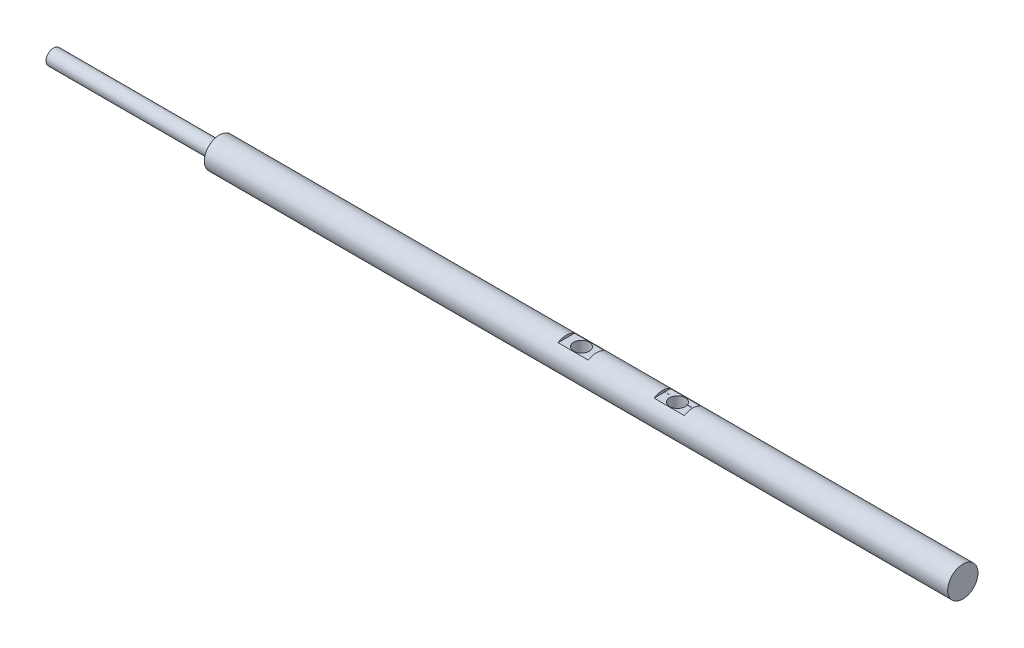
ISO-10303-21;
HEADER;
FILE_DESCRIPTION(('STEP AP214'),'2;1');
FILE_NAME('part.step','',(''),(''),'','','');
FILE_SCHEMA(('AUTOMOTIVE_DESIGN { 1 0 10303 214 1 1 1 1 }'));
ENDSEC;
DATA;
#1=APPLICATION_CONTEXT('core data for automotive mechanical design processes');
#2=APPLICATION_PROTOCOL_DEFINITION('international standard','automotive_design',2000,#1);
#3=PRODUCT_CONTEXT('',#1,'mechanical');
#4=PRODUCT('Part','Part','',(#3));
#5=PRODUCT_RELATED_PRODUCT_CATEGORY('part','',(#4));
#6=PRODUCT_DEFINITION_FORMATION('','',#4);
#7=PRODUCT_DEFINITION_CONTEXT('part definition',#1,'design');
#8=PRODUCT_DEFINITION('design','',#6,#7);
#9=PRODUCT_DEFINITION_SHAPE('','',#8);
#10=(LENGTH_UNIT() NAMED_UNIT(*) SI_UNIT(.MILLI.,.METRE.));
#11=(NAMED_UNIT(*) PLANE_ANGLE_UNIT() SI_UNIT($,.RADIAN.));
#12=(NAMED_UNIT(*) SI_UNIT($,.STERADIAN.) SOLID_ANGLE_UNIT());
#13=UNCERTAINTY_MEASURE_WITH_UNIT(LENGTH_MEASURE(1.E-05),#10,'distance_accuracy_value','');
#14=(GEOMETRIC_REPRESENTATION_CONTEXT(3) GLOBAL_UNCERTAINTY_ASSIGNED_CONTEXT((#13)) GLOBAL_UNIT_ASSIGNED_CONTEXT((#10,
#11,#12)) REPRESENTATION_CONTEXT('',''));
#15=CARTESIAN_POINT('',(0.,0.,0.));
#16=DIRECTION('',(0.,0.,1.));
#17=DIRECTION('',(1.,0.,0.));
#18=AXIS2_PLACEMENT_3D('',#15,#16,#17);
#19=CARTESIAN_POINT('',(95.25,0.,0.));
#20=DIRECTION('',(-1.,0.,0.));
#21=DIRECTION('',(0.,0.,1.));
#22=AXIS2_PLACEMENT_3D('',#19,#20,#21);
#23=CYLINDRICAL_SURFACE('',#22,3.175);
#24=CARTESIAN_POINT('',(95.25,0.,0.));
#25=DIRECTION('',(1.,0.,0.));
#26=DIRECTION('',(0.,0.,-1.));
#27=AXIS2_PLACEMENT_3D('',#24,#25,#26);
#28=CIRCLE('',#27,3.175);
#29=CARTESIAN_POINT('',(95.25,0.,-3.175));
#30=VERTEX_POINT('',#29);
#31=EDGE_CURVE('E203',#30,#30,#28,.T.);
#32=ORIENTED_EDGE('',*,*,#31,.F.);
#33=EDGE_LOOP('',(#32));
#34=FACE_BOUND('',#33,.T.);
#35=CARTESIAN_POINT('',(38.633343193379,0.,0.));
#36=DIRECTION('',(-0.999999999985996,5.29223403398786E-06,0.));
#37=DIRECTION('',(-5.29223403398786E-06,-0.999999999985996,0.));
#38=AXIS2_PLACEMENT_3D('',#35,#36,#37);
#39=ELLIPSE('',#38,3.17500000004446,3.175);
#40=CARTESIAN_POINT('',(38.6333599958514,3.17492996585615,-0.0210881935847739));
#41=VERTEX_POINT('',#40);
#42=CARTESIAN_POINT('',(38.6333573073966,2.66692996586326,-1.72282023356489));
#43=VERTEX_POINT('',#42);
#44=EDGE_CURVE('E248',#41,#43,#39,.T.);
#45=ORIENTED_EDGE('',*,*,#44,.F.);
#46=CARTESIAN_POINT('',(38.665309995851,3.17492979676927,-0.0211136350879527));
#47=CARTESIAN_POINT('',(37.5963265134474,3.17493545408003,-0.0202846489398166));
#48=CARTESIAN_POINT('',(36.5273431055831,3.17494111139039,-0.019375173684114));
#49=CARTESIAN_POINT('',(34.3893764389464,3.17495242601032,-0.0173952449575876));
#50=CARTESIAN_POINT('',(33.320393180174,3.17495808331989,-0.0163247914867658));
#51=CARTESIAN_POINT('',(32.2514099959409,3.17496374062907,-0.0151738489083794));
#52=B_SPLINE_CURVE_WITH_KNOTS('',3,(#46,#47,#48,#49,#50,#51),.UNSPECIFIED.,.F.,.F.,(4,2,4),(0.,
3.20695138428964,6.41390276853995),.UNSPECIFIED.);
#53=CARTESIAN_POINT('',(37.0902296318532,3.17493813246316,-0.0198205709133526));
#54=VERTEX_POINT('',#53);
#55=EDGE_CURVE('E196',#41,#54,#52,.T.);
#56=ORIENTED_EDGE('',*,*,#55,.T.);
#57=CARTESIAN_POINT('',(37.090229631876,3.17493813246316,-0.0198205709136295));
#58=CARTESIAN_POINT('',(37.0902496934034,3.17494844352971,-0.01816890604515));
#59=CARTESIAN_POINT('',(37.0902672475911,3.17495746590815,-0.0165172026754431));
#60=CARTESIAN_POINT('',(37.0902973403694,3.17497293280011,-0.0132137838652389));
#61=CARTESIAN_POINT('',(37.0903098790988,3.17497937738492,-0.0115620684263389));
#62=CARTESIAN_POINT('',(37.0903299409676,3.17498968867624,-0.00825862950065401));
#63=CARTESIAN_POINT('',(37.0903374641996,3.17499355543029,-0.00660690601457919));
#64=CARTESIAN_POINT('',(37.0903474951304,3.17499871108029,-0.00330345501888027));
#65=CARTESIAN_POINT('',(37.0903500028756,3.175,-0.00165172750943369));
#66=CARTESIAN_POINT('',(37.0903500028756,3.175,0.00165172750945899));
#67=CARTESIAN_POINT('',(37.0903474951304,3.17499871108029,0.0033034550189051));
#68=CARTESIAN_POINT('',(37.0903374641996,3.17499355543029,0.00660690601460308));
#69=CARTESIAN_POINT('',(37.0903299409676,3.17498968867624,0.00825862950067743));
#70=CARTESIAN_POINT('',(37.0903098790988,3.17497937738492,0.0115620684263614));
#71=CARTESIAN_POINT('',(37.0902973403694,3.17497293280011,0.0132137838652609));
#72=CARTESIAN_POINT('',(37.0902672475911,3.17495746590815,0.0165172026754633));
#73=CARTESIAN_POINT('',(37.0902496934034,3.17494844352971,0.0181689060451687));
#74=CARTESIAN_POINT('',(37.090229631876,3.17493813246316,0.0198205709136468));
#75=B_SPLINE_CURVE_WITH_KNOTS('',3,(#57,#58,#59,#60,#61,#62,#63,#64,#65,#66,#67,#68,#69,#70,#71,
#72,#73,#74),.UNSPECIFIED.,.F.,.F.,(4,2,2,2,2,2,2,2,4),(0.,0.00495545424362061,
0.00991077142824259,0.0148659972380935,0.0198211773599271,0.0247763574817593,0.0297315832916088,
0.0346869004762294,0.0396423547198458),.UNSPECIFIED.);
#76=CARTESIAN_POINT('',(37.0902296318532,3.17493813246316,0.0198205709133696));
#77=VERTEX_POINT('',#76);
#78=EDGE_CURVE('E258',#54,#77,#75,.T.);
#79=ORIENTED_EDGE('',*,*,#78,.T.);
#80=CARTESIAN_POINT('',(32.251409995941,3.17496374062907,0.0151738489083089));
#81=CARTESIAN_POINT('',(33.3203931801741,3.17495808331989,0.0163247914867198));
#82=CARTESIAN_POINT('',(34.3893764389465,3.17495242601032,0.0173952449575659));
#83=CARTESIAN_POINT('',(36.5273431055831,3.17494111139039,0.019375173684141));
#84=CARTESIAN_POINT('',(37.5963265134474,3.17493545408003,0.0202846489398679));
#85=CARTESIAN_POINT('',(38.665309995851,3.17492979676927,0.0211136350880282));
#86=B_SPLINE_CURVE_WITH_KNOTS('',3,(#80,#81,#82,#83,#84,#85),.UNSPECIFIED.,.F.,.F.,(4,2,4),(0.,
3.20695138425026,6.41390276853985),.UNSPECIFIED.);
#87=CARTESIAN_POINT('',(38.6333599958514,3.17492996585615,0.0210881935848646));
#88=VERTEX_POINT('',#87);
#89=EDGE_CURVE('E192',#77,#88,#86,.T.);
#90=ORIENTED_EDGE('',*,*,#89,.T.);
#91=CARTESIAN_POINT('',(38.6333573073966,2.66692996586326,1.72282023356489));
#92=VERTEX_POINT('',#91);
#93=EDGE_CURVE('E255',#92,#88,#39,.T.);
#94=ORIENTED_EDGE('',*,*,#93,.F.);
#95=CARTESIAN_POINT('',(32.2514073074859,2.66696374063618,1.72276794900877));
#96=CARTESIAN_POINT('',(33.3203906408043,2.66695808332621,1.72277670672593));
#97=CARTESIAN_POINT('',(34.3893739741227,2.66695242601625,1.7227854644431));
#98=CARTESIAN_POINT('',(36.5273406407594,2.66694111139632,1.72280297987743));
#99=CARTESIAN_POINT('',(37.5963239740777,2.66693545408635,1.7228117375946));
#100=CARTESIAN_POINT('',(38.6653073073961,2.66692979677639,1.72282049531176));
#101=B_SPLINE_CURVE_WITH_KNOTS('',3,(#95,#96,#97,#98,#99,#100),.UNSPECIFIED.,.F.,.F.,(4,2,4),
(0.,3.20695000010762,6.41390000021524),.UNSPECIFIED.);
#102=CARTESIAN_POINT('',(32.2833573074855,2.6669635715493,1.7227682107669));
#103=VERTEX_POINT('',#102);
#104=EDGE_CURVE('E130',#103,#92,#101,.T.);
#105=ORIENTED_EDGE('',*,*,#104,.F.);
#106=CARTESIAN_POINT('',(32.2833431932901,0.,0.));
#107=DIRECTION('',(-0.999999999985996,5.29223402032862E-06,0.));
#108=DIRECTION('',(-5.29223402032862E-06,-0.999999999985996,0.));
#109=AXIS2_PLACEMENT_3D('',#106,#107,#108);
#110=ELLIPSE('',#109,3.17500000004446,3.175);
#111=CARTESIAN_POINT('',(32.2833599959404,3.17496357154219,0.0152091873574511));
#112=VERTEX_POINT('',#111);
#113=EDGE_CURVE('E257',#103,#112,#110,.T.);
#114=ORIENTED_EDGE('',*,*,#113,.T.);
#115=CARTESIAN_POINT('',(33.8265367630242,3.1749554046896,0.0168279004127774));
#116=VERTEX_POINT('',#115);
#117=EDGE_CURVE('E122',#112,#116,#86,.T.);
#118=ORIENTED_EDGE('',*,*,#117,.T.);
#119=CARTESIAN_POINT('',(33.8265367630014,3.1749554046896,0.016827900412959));
#120=CARTESIAN_POINT('',(33.8265223024111,3.17496283714282,0.0154256055961563));
#121=CARTESIAN_POINT('',(33.8265096492121,3.17496934064082,0.0140232872170993));
#122=CARTESIAN_POINT('',(33.8264879580734,3.17498048947243,0.0112186430720871));
#123=CARTESIAN_POINT('',(33.8264789200617,3.1749851348431,0.00981631730683655));
#124=CARTESIAN_POINT('',(33.826464459294,3.17499256741311,0.0070116608514302));
#125=CARTESIAN_POINT('',(33.82645903649,3.17499535463716,0.00560933016158764));
#126=CARTESIAN_POINT('',(33.8264518061079,3.17499907092443,0.00280466631962063));
#127=CARTESIAN_POINT('',(33.826449998506,3.17499999999999,0.0014023331675745));
#128=CARTESIAN_POINT('',(33.8264499985059,3.17500000000001,-0.00140233313652295));
#129=CARTESIAN_POINT('',(33.8264518061079,3.17499907092445,-0.00280466628857427));
#130=CARTESIAN_POINT('',(33.8264590364899,3.17499535463722,-0.00560933013056246));
#131=CARTESIAN_POINT('',(33.8264644592939,3.17499256741318,-0.00701166082042103));
#132=CARTESIAN_POINT('',(33.8264789200616,3.17498513484319,-0.00981631727587045));
#133=CARTESIAN_POINT('',(33.8264879580732,3.17498048947254,-0.0112186430411481));
#134=CARTESIAN_POINT('',(33.8265096492118,3.17496934064095,-0.0140232871862255));
#135=CARTESIAN_POINT('',(33.8265223024108,3.17496283714297,-0.0154256055653207));
#136=CARTESIAN_POINT('',(33.826536763001,3.17495540468976,-0.0168279003821615));
#137=B_SPLINE_CURVE_WITH_KNOTS('',3,(#119,#120,#121,#122,#123,#124,#125,#126,#127,#128,#129,
#130,#131,#132,#133,#134,#135,#136),.UNSPECIFIED.,.F.,.F.,(4,2,2,2,2,2,2,2,4),(0.,
0.00420716573795598,0.00841424759947161,0.0126212735424362,0.0168282715258546,
0.0210352695092885,0.0252422954523007,0.0294493773138969,0.0336565430519664),.UNSPECIFIED.);
#138=CARTESIAN_POINT('',(33.826536763001,3.17495540468976,-0.01682790038216));
#139=VERTEX_POINT('',#138);
#140=EDGE_CURVE('E264',#116,#139,#137,.T.);
#141=ORIENTED_EDGE('',*,*,#140,.T.);
#142=CARTESIAN_POINT('',(32.2833599959404,3.17496357154219,-0.0152091873573705));
#143=VERTEX_POINT('',#142);
#144=EDGE_CURVE('E64',#139,#143,#52,.T.);
#145=ORIENTED_EDGE('',*,*,#144,.T.);
#146=CARTESIAN_POINT('',(32.2833573074855,2.6669635715493,-1.7227682107669));
#147=VERTEX_POINT('',#146);
#148=EDGE_CURVE('E261',#143,#147,#110,.T.);
#149=ORIENTED_EDGE('',*,*,#148,.T.);
#150=CARTESIAN_POINT('',(38.6653073073961,2.66692979677639,-1.72282049531176));
#151=CARTESIAN_POINT('',(37.5963239740778,2.66693545408635,-1.7228117375946));
#152=CARTESIAN_POINT('',(36.5273406407594,2.66694111139632,-1.72280297987743));
#153=CARTESIAN_POINT('',(34.3893739741227,2.66695242601625,-1.7227854644431));
#154=CARTESIAN_POINT('',(33.3203906408043,2.66695808332621,-1.72277670672593));
#155=CARTESIAN_POINT('',(32.2514073074859,2.66696374063618,-1.72276794900877));
#156=B_SPLINE_CURVE_WITH_KNOTS('',3,(#150,#151,#152,#153,#154,#155),.UNSPECIFIED.,.F.,.F.,(4,2,
4),(0.,3.20695000010762,6.41390000021525),.UNSPECIFIED.);
#157=EDGE_CURVE('E137',#43,#147,#156,.T.);
#158=ORIENTED_EDGE('',*,*,#157,.F.);
#159=EDGE_LOOP('',(#45,#56,#79,#90,#94,#105,#114,#118,#141,#145,#149,#158));
#160=FACE_BOUND('',#159,.T.);
#161=CARTESIAN_POINT('',(33.82645,-3.175,0.));
#162=CARTESIAN_POINT('',(33.8264555225033,-3.1749951488375,0.0855040308867798));
#163=CARTESIAN_POINT('',(33.833209178857,-3.17150945034314,0.171101240980394));
#164=CARTESIAN_POINT('',(33.8599163776356,-3.15790866903868,0.339747436628674));
#165=CARTESIAN_POINT('',(33.8798930920065,-3.14778194886196,0.422791680581357));
#166=CARTESIAN_POINT('',(33.9320492367121,-3.12195472243027,0.583638724841476));
#167=CARTESIAN_POINT('',(33.964180383854,-3.10627628578511,0.661460848087696));
#168=CARTESIAN_POINT('',(34.0394733428141,-3.07076815311594,0.810484123550455));
#169=CARTESIAN_POINT('',(34.0826346813397,-3.05093863521649,0.881685559674045));
#170=CARTESIAN_POINT('',(34.1818395604511,-3.00746719747756,1.02048121130391));
#171=CARTESIAN_POINT('',(34.2385224488686,-2.98366396287073,1.08756713179621));
#172=CARTESIAN_POINT('',(34.3617778321314,-2.93542614793103,1.2117528273621));
#173=CARTESIAN_POINT('',(34.428358245603,-2.91099107513947,1.2688445260646));
#174=CARTESIAN_POINT('',(34.5761429961395,-2.86190360269902,1.37619030697555));
#175=CARTESIAN_POINT('',(34.6581028961507,-2.83740198308611,1.42548150207459));
#176=CARTESIAN_POINT('',(34.8305279187006,-2.79368352283181,1.50937386299453));
#177=CARTESIAN_POINT('',(34.920986670407,-2.77446276535017,1.5439859268111));
#178=CARTESIAN_POINT('',(35.1022318810971,-2.74531170361422,1.59521646703193));
#179=CARTESIAN_POINT('',(35.1926597461213,-2.73488497790481,1.6128061882074));
#180=CARTESIAN_POINT('',(35.3757330951833,-2.72321398214475,1.63244506669711));
#181=CARTESIAN_POINT('',(35.4683760410271,-2.72195966421048,1.63451122931009));
#182=CARTESIAN_POINT('',(35.6404642889754,-2.72838052371714,1.62375488998901));
#183=CARTESIAN_POINT('',(35.7200793205153,-2.73493188161208,1.61280661192532));
#184=CARTESIAN_POINT('',(35.8761289781891,-2.754244052702,1.57959805780023));
#185=CARTESIAN_POINT('',(35.9525624793788,-2.76700704233323,1.55733381672187));
#186=CARTESIAN_POINT('',(36.1022619863812,-2.79757317703649,1.50174237151051));
#187=CARTESIAN_POINT('',(36.1754140956642,-2.81548590050608,1.46817158068447));
#188=CARTESIAN_POINT('',(36.3154068420419,-2.85434643346265,1.3911117741889));
#189=CARTESIAN_POINT('',(36.3822446252442,-2.87529560459822,1.34761830379583));
#190=CARTESIAN_POINT('',(36.5172112960908,-2.9212823355769,1.24510866496992));
#191=CARTESIAN_POINT('',(36.5842961673622,-2.94649001082675,1.18478955639875));
#192=CARTESIAN_POINT('',(36.7078475723355,-2.99587607308416,1.05368879547657));
#193=CARTESIAN_POINT('',(36.7643084679871,-3.02005390832908,0.98290162320231));
#194=CARTESIAN_POINT('',(36.8677700161712,-3.06617549731913,0.828265705690738));
#195=CARTESIAN_POINT('',(36.9141314172438,-3.08793935855511,0.743931167771745));
#196=CARTESIAN_POINT('',(36.9916180876571,-3.12521410360782,0.567260694455102));
#197=CARTESIAN_POINT('',(37.0227560898711,-3.14073021113217,0.474931522136976));
#198=CARTESIAN_POINT('',(37.0662353646927,-3.16262223827194,0.293387639639186));
#199=CARTESIAN_POINT('',(37.0799610922109,-3.16966860606962,0.204586275933954));
#200=CARTESIAN_POINT('',(37.0926065067292,-3.17615517440242,0.0256756682936774));
#201=CARTESIAN_POINT('',(37.0915338203541,-3.1755992928927,-0.0644328780430845));
#202=CARTESIAN_POINT('',(37.0753694600984,-3.16732011452037,-0.23544240019834));
#203=CARTESIAN_POINT('',(37.0614474939361,-3.16019489932875,-0.316487355429185));
#204=CARTESIAN_POINT('',(37.0218532383627,-3.14029584966157,-0.474914137414346));
#205=CARTESIAN_POINT('',(36.9961796852722,-3.12752140771467,-0.552295569232576));
#206=CARTESIAN_POINT('',(36.9331979936897,-3.0970332421052,-0.7036598506893));
#207=CARTESIAN_POINT('',(36.8955917765208,-3.07919436719925,-0.777492553668178));
#208=CARTESIAN_POINT('',(36.8101576756426,-3.04025788262466,-0.918032193793199));
#209=CARTESIAN_POINT('',(36.7623255652911,-3.01915892647785,-0.984736167288267));
#210=CARTESIAN_POINT('',(36.6521647755565,-2.97316030571577,-1.11637209875045));
#211=CARTESIAN_POINT('',(36.5888535975356,-2.94809264371233,-1.18042445249867));
#212=CARTESIAN_POINT('',(36.4524099268942,-2.89851338679948,-1.29741693757462));
#213=CARTESIAN_POINT('',(36.3792697567467,-2.87400224426709,-1.35034829848397));
#214=CARTESIAN_POINT('',(36.2201223874983,-2.82692373103994,-1.44642697458146));
#215=CARTESIAN_POINT('',(36.1336238429623,-2.80454223847877,-1.4888598544623));
#216=CARTESIAN_POINT('',(35.9532087006801,-2.76667242464635,-1.55811686536916));
#217=CARTESIAN_POINT('',(35.8593023439866,-2.75117477674318,-1.58496213065223));
#218=CARTESIAN_POINT('',(35.6764853526163,-2.73084264145901,-1.61972010578002));
#219=CARTESIAN_POINT('',(35.5879787017558,-2.72511675716505,-1.62922186279037));
#220=CARTESIAN_POINT('',(35.410487714574,-2.72246308853736,-1.63365628662516));
#221=CARTESIAN_POINT('',(35.3215036525793,-2.72553069992366,-1.62859657783691));
#222=CARTESIAN_POINT('',(35.1555499074751,-2.73915192416445,-1.60555713446221));
#223=CARTESIAN_POINT('',(35.0783054098004,-2.74887888063314,-1.5890014905719));
#224=CARTESIAN_POINT('',(34.9277982454205,-2.77369521283357,-1.54527280818542));
#225=CARTESIAN_POINT('',(34.8545369351526,-2.78878640228,-1.51809617829068));
#226=CARTESIAN_POINT('',(34.7086581146745,-2.82384943425746,-1.4518910164788));
#227=CARTESIAN_POINT('',(34.6364078760544,-2.84407923565314,-1.41219413521422));
#228=CARTESIAN_POINT('',(34.4991147021694,-2.88675020129082,-1.32278190926592));
#229=CARTESIAN_POINT('',(34.4340756362287,-2.9091925406384,-1.27306122601301));
#230=CARTESIAN_POINT('',(34.3041779098411,-2.95727706115646,-1.15738981002724));
#231=CARTESIAN_POINT('',(34.2404590585516,-2.98295328229731,-1.09016618990103));
#232=CARTESIAN_POINT('',(34.1249126673504,-3.03196509152523,-0.945333004302651));
#233=CARTESIAN_POINT('',(34.0730920125456,-3.05529932000234,-0.867717466275219));
#234=CARTESIAN_POINT('',(33.9824042427265,-3.09746555259877,-0.702628256295633));
#235=CARTESIAN_POINT('',(33.9437237810696,-3.11623168849883,-0.615034384222225));
#236=CARTESIAN_POINT('',(33.8821591182301,-3.14661314164253,-0.433428747203517));
#237=CARTESIAN_POINT('',(33.8592310751803,-3.15824829587962,-0.33943560166896));
#238=CARTESIAN_POINT('',(33.8386932306584,-3.16872129723131,-0.203672524735642));
#239=CARTESIAN_POINT('',(33.8341093436488,-3.17106888783632,-0.163117552345112));
#240=CARTESIAN_POINT('',(33.8279863698368,-3.17420941832953,-0.0817154873383494));
#241=CARTESIAN_POINT('',(33.8264473604074,-3.1750023187116,-0.0408683873253513));
#242=CARTESIAN_POINT('',(33.82645,-3.175,0.));
#243=B_SPLINE_CURVE_WITH_KNOTS('',3,(#161,#162,#163,#164,#165,#166,#167,#168,#169,#170,#171,
#172,#173,#174,#175,#176,#177,#178,#179,#180,#181,#182,#183,#184,#185,#186,#187,#188,#189,#190,
#191,#192,#193,#194,#195,#196,#197,#198,#199,#200,#201,#202,#203,#204,#205,#206,#207,#208,#209,
#210,#211,#212,#213,#214,#215,#216,#217,#218,#219,#220,#221,#222,#223,#224,#225,#226,#227,#228,
#229,#230,#231,#232,#233,#234,#235,#236,#237,#238,#239,#240,#241,#242),.UNSPECIFIED.,.T.,.F.,(4,
2,2,2,2,2,2,2,2,2,2,2,2,2,2,2,2,2,2,2,2,2,2,2,2,2,2,2,2,2,2,2,2,2,2,2,2,2,2,2,4),(0.,
0.256346681545549,0.513143775789515,0.768931283875209,1.02470781826618,1.29656656346873,
1.56864399473168,1.86333819539519,2.15781322626888,2.43427334950282,2.7104305799831,
2.95119493604626,3.19204371210589,3.43845399875805,3.68497512818485,3.96477950659083,
4.24473195848559,4.53914409915751,4.83330957000078,5.10221547434752,5.37098279845146,
5.61746624990917,5.86397621261563,6.11720599093002,6.37054063911958,6.64979553878125,
6.92926984912037,7.22440425351108,7.51913756384894,7.78517049872054,8.05106416402478,
8.28881648429829,8.5266492682086,8.78030889713808,9.03410398105976,9.32114681972758,
9.60835534464034,9.89948790747401,10.1898068764044,10.3123298633967,10.4348559637725),.UNSPECIFIED.);
#244=CARTESIAN_POINT('',(33.82645,-3.175,0.));
#245=VERTEX_POINT('',#244);
#246=EDGE_CURVE('E206',#245,#245,#243,.T.);
#247=ORIENTED_EDGE('',*,*,#246,.T.);
#248=EDGE_LOOP('',(#247));
#249=FACE_BOUND('',#248,.T.);
#250=DIRECTION('',(-1.,0.,0.));
#251=VECTOR('',#250,1.);
#252=CARTESIAN_POINT('',(95.25,2.667,1.72271181571382));
#253=LINE('',#252,#251);
#254=CARTESIAN_POINT('',(18.5166,2.667,1.72271181571382));
#255=VERTEX_POINT('',#254);
#256=CARTESIAN_POINT('',(12.1666,2.667,1.72271181571382));
#257=VERTEX_POINT('',#256);
#258=EDGE_CURVE('E117',#255,#257,#253,.T.);
#259=ORIENTED_EDGE('',*,*,#258,.T.);
#260=CARTESIAN_POINT('',(12.1666,0.,0.));
#261=DIRECTION('',(-1.,0.,0.));
#262=DIRECTION('',(0.,0.,1.));
#263=AXIS2_PLACEMENT_3D('',#260,#261,#262);
#264=CIRCLE('',#263,3.175);
#265=CARTESIAN_POINT('',(12.1666,2.667,-1.72271181571382));
#266=VERTEX_POINT('',#265);
#267=EDGE_CURVE('E49',#257,#266,#264,.T.);
#268=ORIENTED_EDGE('',*,*,#267,.T.);
#269=DIRECTION('',(-1.,0.,0.));
#270=VECTOR('',#269,1.);
#271=CARTESIAN_POINT('',(95.25,2.667,-1.72271181571382));
#272=LINE('',#271,#270);
#273=CARTESIAN_POINT('',(18.5166,2.667,-1.72271181571382));
#274=VERTEX_POINT('',#273);
#275=EDGE_CURVE('E115',#266,#274,#272,.F.);
#276=ORIENTED_EDGE('',*,*,#275,.T.);
#277=CARTESIAN_POINT('',(18.5166,0.,0.));
#278=DIRECTION('',(-1.,0.,0.));
#279=DIRECTION('',(0.,0.,1.));
#280=AXIS2_PLACEMENT_3D('',#277,#278,#279);
#281=CIRCLE('',#280,3.175);
#282=EDGE_CURVE('E12',#255,#274,#281,.T.);
#283=ORIENTED_EDGE('',*,*,#282,.F.);
#284=EDGE_LOOP('',(#259,#268,#276,#283));
#285=FACE_BOUND('',#284,.T.);
#286=CARTESIAN_POINT('',(13.70965,-3.175,0.));
#287=CARTESIAN_POINT('',(13.7096555225033,-3.1749951488375,0.0855040308867805));
#288=CARTESIAN_POINT('',(13.716409178857,-3.17150945034315,0.171101240980395));
#289=CARTESIAN_POINT('',(13.7431163776356,-3.15790866903868,0.339747436628676));
#290=CARTESIAN_POINT('',(13.7630930920065,-3.14778194886196,0.422791680581358));
#291=CARTESIAN_POINT('',(13.8152492367121,-3.12195472243027,0.583638724841478));
#292=CARTESIAN_POINT('',(13.847380383854,-3.10627628578511,0.661460848087699));
#293=CARTESIAN_POINT('',(13.922673342814,-3.07076815311594,0.810484123550459));
#294=CARTESIAN_POINT('',(13.9658346813397,-3.05093863521649,0.881685559674048));
#295=CARTESIAN_POINT('',(14.0650395604511,-3.00746719747756,1.02048121130391));
#296=CARTESIAN_POINT('',(14.1217224488686,-2.98366396287073,1.08756713179621));
#297=CARTESIAN_POINT('',(14.2449778321314,-2.93542614793103,1.2117528273621));
#298=CARTESIAN_POINT('',(14.311558245603,-2.91099107513947,1.2688445260646));
#299=CARTESIAN_POINT('',(14.4593429961395,-2.86190360269902,1.37619030697555));
#300=CARTESIAN_POINT('',(14.5413028961507,-2.8374019830861,1.4254815020746));
#301=CARTESIAN_POINT('',(14.7137279187006,-2.79368352283181,1.50937386299454));
#302=CARTESIAN_POINT('',(14.804186670407,-2.77446276535016,1.54398592681111));
#303=CARTESIAN_POINT('',(14.9854318810971,-2.74531170361422,1.59521646703194));
#304=CARTESIAN_POINT('',(15.0758597461213,-2.7348849779048,1.61280618820741));
#305=CARTESIAN_POINT('',(15.2589330951833,-2.72321398214474,1.63244506669712));
#306=CARTESIAN_POINT('',(15.3515760410271,-2.72195966421048,1.63451122931009));
#307=CARTESIAN_POINT('',(15.5236642889754,-2.72838052371713,1.62375488998901));
#308=CARTESIAN_POINT('',(15.6032793205153,-2.73493188161207,1.61280661192532));
#309=CARTESIAN_POINT('',(15.7593289781891,-2.754244052702,1.57959805780023));
#310=CARTESIAN_POINT('',(15.8357624793788,-2.76700704233323,1.55733381672187));
#311=CARTESIAN_POINT('',(15.9854619863812,-2.79757317703649,1.50174237151051));
#312=CARTESIAN_POINT('',(16.0586140956642,-2.81548590050608,1.46817158068447));
#313=CARTESIAN_POINT('',(16.1986068420419,-2.85434643346265,1.3911117741889));
#314=CARTESIAN_POINT('',(16.2654446252442,-2.87529560459822,1.34761830379583));
#315=CARTESIAN_POINT('',(16.4004112960908,-2.9212823355769,1.24510866496992));
#316=CARTESIAN_POINT('',(16.4674961673622,-2.94649001082675,1.18478955639875));
#317=CARTESIAN_POINT('',(16.5910475723355,-2.99587607308416,1.05368879547657));
#318=CARTESIAN_POINT('',(16.6475084679871,-3.02005390832908,0.982901623202313));
#319=CARTESIAN_POINT('',(16.7509700161712,-3.06617549731913,0.828265705690739));
#320=CARTESIAN_POINT('',(16.7973314172438,-3.08793935855511,0.743931167771745));
#321=CARTESIAN_POINT('',(16.8748180876571,-3.12521410360782,0.567260694455102));
#322=CARTESIAN_POINT('',(16.9059560898711,-3.14073021113217,0.474931522136976));
#323=CARTESIAN_POINT('',(16.9494353646927,-3.16262223827194,0.293387639639186));
#324=CARTESIAN_POINT('',(16.9631610922109,-3.16966860606962,0.204586275933954));
#325=CARTESIAN_POINT('',(16.9758065067292,-3.17615517440242,0.0256756682936787));
#326=CARTESIAN_POINT('',(16.9747338203541,-3.1755992928927,-0.0644328780430827));
#327=CARTESIAN_POINT('',(16.9585694600984,-3.16732011452037,-0.23544240019834));
#328=CARTESIAN_POINT('',(16.9446474939361,-3.16019489932875,-0.316487355429186));
#329=CARTESIAN_POINT('',(16.9050532383627,-3.14029584966157,-0.474914137414348));
#330=CARTESIAN_POINT('',(16.8793796852722,-3.12752140771467,-0.552295569232577));
#331=CARTESIAN_POINT('',(16.8163979936897,-3.0970332421052,-0.703659850689299));
#332=CARTESIAN_POINT('',(16.7787917765208,-3.07919436719925,-0.777492553668176));
#333=CARTESIAN_POINT('',(16.6933576756426,-3.04025788262466,-0.918032193793198));
#334=CARTESIAN_POINT('',(16.6455255652911,-3.01915892647785,-0.984736167288267));
#335=CARTESIAN_POINT('',(16.5353647755565,-2.97316030571577,-1.11637209875045));
#336=CARTESIAN_POINT('',(16.4720535975356,-2.94809264371233,-1.18042445249867));
#337=CARTESIAN_POINT('',(16.3356099268942,-2.89851338679948,-1.29741693757462));
#338=CARTESIAN_POINT('',(16.2624697567467,-2.87400224426708,-1.35034829848397));
#339=CARTESIAN_POINT('',(16.1033223874983,-2.82692373103994,-1.44642697458146));
#340=CARTESIAN_POINT('',(16.0168238429623,-2.80454223847877,-1.4888598544623));
#341=CARTESIAN_POINT('',(15.8364087006801,-2.76667242464635,-1.55811686536916));
#342=CARTESIAN_POINT('',(15.7425023439866,-2.75117477674318,-1.58496213065223));
#343=CARTESIAN_POINT('',(15.5596853526163,-2.73084264145901,-1.61972010578002));
#344=CARTESIAN_POINT('',(15.4711787017558,-2.72511675716505,-1.62922186279037));
#345=CARTESIAN_POINT('',(15.293687714574,-2.72246308853735,-1.63365628662517));
#346=CARTESIAN_POINT('',(15.2047036525793,-2.72553069992366,-1.62859657783691));
#347=CARTESIAN_POINT('',(15.0387499074751,-2.73915192416444,-1.60555713446222));
#348=CARTESIAN_POINT('',(14.9615054098004,-2.74887888063314,-1.5890014905719));
#349=CARTESIAN_POINT('',(14.8109982454205,-2.77369521283357,-1.54527280818543));
#350=CARTESIAN_POINT('',(14.7377369351526,-2.78878640228,-1.51809617829069));
#351=CARTESIAN_POINT('',(14.5918581146745,-2.82384943425745,-1.4518910164788));
#352=CARTESIAN_POINT('',(14.5196078760544,-2.84407923565314,-1.41219413521423));
#353=CARTESIAN_POINT('',(14.3823147021694,-2.88675020129082,-1.32278190926592));
#354=CARTESIAN_POINT('',(14.3172756362287,-2.9091925406384,-1.27306122601301));
#355=CARTESIAN_POINT('',(14.1873779098411,-2.95727706115646,-1.15738981002724));
#356=CARTESIAN_POINT('',(14.1236590585516,-2.98295328229731,-1.09016618990104));
#357=CARTESIAN_POINT('',(14.0081126673504,-3.03196509152523,-0.945333004302657));
#358=CARTESIAN_POINT('',(13.9562920125456,-3.05529932000234,-0.867717466275226));
#359=CARTESIAN_POINT('',(13.8656042427264,-3.09746555259877,-0.70262825629564));
#360=CARTESIAN_POINT('',(13.8269237810695,-3.11623168849883,-0.615034384222231));
#361=CARTESIAN_POINT('',(13.7653591182301,-3.14661314164253,-0.433428747203523));
#362=CARTESIAN_POINT('',(13.7424310751803,-3.15824829587962,-0.339435601668967));
#363=CARTESIAN_POINT('',(13.7218932306584,-3.16872129723131,-0.203672524735649));
#364=CARTESIAN_POINT('',(13.7173093436488,-3.17106888783632,-0.163117552345117));
#365=CARTESIAN_POINT('',(13.7111863698368,-3.17420941832953,-0.0817154873383522));
#366=CARTESIAN_POINT('',(13.7096473604074,-3.1750023187116,-0.0408683873253526));
#367=CARTESIAN_POINT('',(13.70965,-3.175,0.));
#368=B_SPLINE_CURVE_WITH_KNOTS('',3,(#286,#287,#288,#289,#290,#291,#292,#293,#294,#295,#296,
#297,#298,#299,#300,#301,#302,#303,#304,#305,#306,#307,#308,#309,#310,#311,#312,#313,#314,#315,
#316,#317,#318,#319,#320,#321,#322,#323,#324,#325,#326,#327,#328,#329,#330,#331,#332,#333,#334,
#335,#336,#337,#338,#339,#340,#341,#342,#343,#344,#345,#346,#347,#348,#349,#350,#351,#352,#353,
#354,#355,#356,#357,#358,#359,#360,#361,#362,#363,#364,#365,#366,#367),.UNSPECIFIED.,.T.,.F.,(4,
2,2,2,2,2,2,2,2,2,2,2,2,2,2,2,2,2,2,2,2,2,2,2,2,2,2,2,2,2,2,2,2,2,2,2,2,2,2,2,4),(0.,
0.256346681545551,0.513143775789516,0.768931283875213,1.02470781826619,1.29656656346874,
1.56864399473168,1.86333819539519,2.15781322626888,2.43427334950283,2.71043057998311,
2.95119493604628,3.19204371210591,3.43845399875807,3.68497512818486,3.96477950659084,
4.2447319584856,4.53914409915753,4.8333095700008,5.10221547434754,5.37098279845148,
5.61746624990919,5.86397621261565,6.11720599093004,6.37054063911959,6.64979553878126,
6.92926984912039,7.22440425351111,7.51913756384896,7.78517049872057,8.0510641640248,
8.28881648429831,8.52664926820862,8.7803088971381,9.03410398105978,9.3211468197276,
9.60835534464037,9.89948790747403,10.1898068764044,10.3123298633967,10.4348559637725),.UNSPECIFIED.);
#369=CARTESIAN_POINT('',(13.70965,-3.175,0.));
#370=VERTEX_POINT('',#369);
#371=EDGE_CURVE('E213',#370,#370,#368,.T.);
#372=ORIENTED_EDGE('',*,*,#371,.T.);
#373=EDGE_LOOP('',(#372));
#374=FACE_BOUND('',#373,.T.);
#375=CARTESIAN_POINT('',(-60.49518,0.,0.));
#376=DIRECTION('',(-1.,0.,0.));
#377=DIRECTION('',(0.,0.,1.));
#378=AXIS2_PLACEMENT_3D('',#375,#376,#377);
#379=CIRCLE('',#378,3.175);
#380=CARTESIAN_POINT('',(-60.49518,0.,3.175));
#381=VERTEX_POINT('',#380);
#382=EDGE_CURVE('E308',#381,#381,#379,.T.);
#383=ORIENTED_EDGE('',*,*,#382,.F.);
#384=EDGE_LOOP('',(#383));
#385=FACE_BOUND('',#384,.T.);
#386=ADVANCED_FACE('F40',(#34,#160,#249,#285,#374,#385),#23,.T.);
#387=CARTESIAN_POINT('',(35.4584,-3.175,0.));
#388=DIRECTION('',(0.,1.,0.));
#389=DIRECTION('',(0.,0.,1.));
#390=AXIS2_PLACEMENT_3D('',#387,#388,#389);
#391=CYLINDRICAL_SURFACE('',#390,1.63195);
#392=ORIENTED_EDGE('',*,*,#246,.F.);
#393=EDGE_LOOP('',(#392));
#394=FACE_BOUND('',#393,.T.);
#395=CARTESIAN_POINT('',(35.4584,2.66694676848034,0.));
#396=DIRECTION('',(5.29223402196773E-06,0.999999999985996,0.));
#397=DIRECTION('',(-0.999999999985996,5.29223402196773E-06,0.));
#398=AXIS2_PLACEMENT_3D('',#395,#396,#397);
#399=CIRCLE('',#398,1.63195);
#400=CARTESIAN_POINT('',(33.8264500000229,2.66695540514166,0.));
#401=VERTEX_POINT('',#400);
#402=EDGE_CURVE('E138',#401,#401,#399,.F.);
#403=ORIENTED_EDGE('',*,*,#402,.F.);
#404=EDGE_LOOP('',(#403));
#405=FACE_BOUND('',#404,.T.);
#406=ADVANCED_FACE('F217',(#394,#405),#391,.F.);
#407=CARTESIAN_POINT('',(95.25,0.,0.));
#408=DIRECTION('',(1.,0.,0.));
#409=DIRECTION('',(0.,0.,-1.));
#410=AXIS2_PLACEMENT_3D('',#407,#408,#409);
#411=PLANE('',#410);
#412=ORIENTED_EDGE('',*,*,#31,.T.);
#413=EDGE_LOOP('',(#412));
#414=FACE_BOUND('',#413,.T.);
#415=ADVANCED_FACE('F221',(#414),#411,.T.);
#416=CARTESIAN_POINT('',(15.3416,-3.175,0.));
#417=DIRECTION('',(0.,1.,0.));
#418=DIRECTION('',(0.,0.,1.));
#419=AXIS2_PLACEMENT_3D('',#416,#417,#418);
#420=CYLINDRICAL_SURFACE('',#419,1.63195);
#421=CARTESIAN_POINT('',(15.3416,2.667,0.));
#422=DIRECTION('',(0.,-1.,0.));
#423=DIRECTION('',(0.,0.,-1.));
#424=AXIS2_PLACEMENT_3D('',#421,#422,#423);
#425=CIRCLE('',#424,1.63195);
#426=CARTESIAN_POINT('',(15.3416,2.667,-1.63195));
#427=VERTEX_POINT('',#426);
#428=EDGE_CURVE('E118',#427,#427,#425,.F.);
#429=ORIENTED_EDGE('',*,*,#428,.T.);
#430=EDGE_LOOP('',(#429));
#431=FACE_BOUND('',#430,.T.);
#432=ORIENTED_EDGE('',*,*,#371,.F.);
#433=EDGE_LOOP('',(#432));
#434=FACE_BOUND('',#433,.T.);
#435=ADVANCED_FACE('F223',(#431,#434),#420,.F.);
#436=CARTESIAN_POINT('',(18.5166,0.,-3.175));
#437=DIRECTION('',(-1.,0.,0.));
#438=DIRECTION('',(0.,0.,1.));
#439=AXIS2_PLACEMENT_3D('',#436,#437,#438);
#440=PLANE('',#439);
#441=DIRECTION('',(0.,0.,1.));
#442=VECTOR('',#441,1.);
#443=CARTESIAN_POINT('',(18.5166,2.667,-3.175));
#444=LINE('',#443,#442);
#445=EDGE_CURVE('E108',#274,#255,#444,.T.);
#446=ORIENTED_EDGE('',*,*,#445,.T.);
#447=ORIENTED_EDGE('',*,*,#282,.T.);
#448=EDGE_LOOP('',(#446,#447));
#449=FACE_BOUND('',#448,.T.);
#450=ADVANCED_FACE('F107',(#449),#440,.T.);
#451=CARTESIAN_POINT('',(12.1666,0.,-3.175));
#452=DIRECTION('',(-1.,0.,0.));
#453=DIRECTION('',(0.,0.,1.));
#454=AXIS2_PLACEMENT_3D('',#451,#452,#453);
#455=PLANE('',#454);
#456=DIRECTION('',(0.,0.,1.));
#457=VECTOR('',#456,1.);
#458=CARTESIAN_POINT('',(12.1666,2.667,-3.175));
#459=LINE('',#458,#457);
#460=EDGE_CURVE('E56',#266,#257,#459,.T.);
#461=ORIENTED_EDGE('',*,*,#460,.F.);
#462=ORIENTED_EDGE('',*,*,#267,.F.);
#463=EDGE_LOOP('',(#461,#462));
#464=FACE_BOUND('',#463,.T.);
#465=ADVANCED_FACE('F289',(#464),#455,.F.);
#466=CARTESIAN_POINT('',(0.,2.667,-3.175));
#467=DIRECTION('',(0.,-1.,0.));
#468=DIRECTION('',(0.,0.,-1.));
#469=AXIS2_PLACEMENT_3D('',#466,#467,#468);
#470=PLANE('',#469);
#471=ORIENTED_EDGE('',*,*,#428,.F.);
#472=EDGE_LOOP('',(#471));
#473=FACE_BOUND('',#472,.T.);
#474=ORIENTED_EDGE('',*,*,#445,.F.);
#475=ORIENTED_EDGE('',*,*,#275,.F.);
#476=ORIENTED_EDGE('',*,*,#460,.T.);
#477=ORIENTED_EDGE('',*,*,#258,.F.);
#478=EDGE_LOOP('',(#474,#475,#476,#477));
#479=FACE_BOUND('',#478,.T.);
#480=ADVANCED_FACE('F114',(#473,#479),#470,.F.);
#481=CARTESIAN_POINT('',(38.633343192297,-0.00020445669369187,-3.175));
#482=DIRECTION('',(-0.999999999985996,5.29223403398786E-06,0.));
#483=DIRECTION('',(-5.29223403398786E-06,-0.999999999985996,0.));
#484=AXIS2_PLACEMENT_3D('',#481,#482,#483);
#485=PLANE('',#484);
#486=ORIENTED_EDGE('',*,*,#93,.T.);
#487=DIRECTION('',(0.,0.,1.));
#488=VECTOR('',#487,1.);
#489=CARTESIAN_POINT('',(38.6333599958514,3.17492996585615,-3.175));
#490=LINE('',#489,#488);
#491=EDGE_CURVE('E127',#41,#88,#490,.T.);
#492=ORIENTED_EDGE('',*,*,#491,.F.);
#493=ORIENTED_EDGE('',*,*,#44,.T.);
#494=DIRECTION('',(0.,0.,1.));
#495=VECTOR('',#494,1.);
#496=CARTESIAN_POINT('',(38.6333573073966,2.66692996586326,-3.175));
#497=LINE('',#496,#495);
#498=EDGE_CURVE('E318',#43,#92,#497,.T.);
#499=ORIENTED_EDGE('',*,*,#498,.T.);
#500=EDGE_LOOP('',(#486,#492,#493,#499));
#501=FACE_BOUND('',#500,.T.);
#502=ADVANCED_FACE('F156',(#501),#485,.T.);
#503=CARTESIAN_POINT('',(32.283343192386,-0.000170851007135082,-3.175));
#504=DIRECTION('',(-0.999999999985996,5.29223402032862E-06,0.));
#505=DIRECTION('',(-5.29223402032862E-06,-0.999999999985996,0.));
#506=AXIS2_PLACEMENT_3D('',#503,#504,#505);
#507=PLANE('',#506);
#508=DIRECTION('',(0.,0.,1.));
#509=VECTOR('',#508,1.);
#510=CARTESIAN_POINT('',(32.2833573074855,2.6669635715493,-3.175));
#511=LINE('',#510,#509);
#512=EDGE_CURVE('E321',#147,#103,#511,.T.);
#513=ORIENTED_EDGE('',*,*,#512,.F.);
#514=ORIENTED_EDGE('',*,*,#148,.F.);
#515=DIRECTION('',(0.,0.,1.));
#516=VECTOR('',#515,1.);
#517=CARTESIAN_POINT('',(32.2833599959404,3.17496357154219,-3.175));
#518=LINE('',#517,#516);
#519=EDGE_CURVE('E310',#143,#112,#518,.T.);
#520=ORIENTED_EDGE('',*,*,#519,.T.);
#521=ORIENTED_EDGE('',*,*,#113,.F.);
#522=EDGE_LOOP('',(#513,#514,#520,#521));
#523=FACE_BOUND('',#522,.T.);
#524=ADVANCED_FACE('F150',(#523),#507,.F.);
#525=CARTESIAN_POINT('',(1.41150995324124E-05,2.66713442255649,-3.175));
#526=DIRECTION('',(5.29223402196773E-06,0.999999999985996,0.));
#527=DIRECTION('',(-0.999999999985996,5.29223402196773E-06,0.));
#528=AXIS2_PLACEMENT_3D('',#525,#526,#527);
#529=PLANE('',#528);
#530=ORIENTED_EDGE('',*,*,#402,.T.);
#531=EDGE_LOOP('',(#530));
#532=FACE_BOUND('',#531,.T.);
#533=ORIENTED_EDGE('',*,*,#157,.T.);
#534=ORIENTED_EDGE('',*,*,#512,.T.);
#535=ORIENTED_EDGE('',*,*,#104,.T.);
#536=ORIENTED_EDGE('',*,*,#498,.F.);
#537=EDGE_LOOP('',(#533,#534,#535,#536));
#538=FACE_BOUND('',#537,.T.);
#539=ADVANCED_FACE('F144',(#532,#538),#529,.T.);
#540=CARTESIAN_POINT('',(1.68035544153551E-05,3.17513442254937,-3.175));
#541=DIRECTION('',(5.29223402189943E-06,0.999999999985996,0.));
#542=DIRECTION('',(-0.999999999985996,5.29223402189943E-06,0.));
#543=AXIS2_PLACEMENT_3D('',#540,#541,#542);
#544=PLANE('',#543);
#545=ORIENTED_EDGE('',*,*,#491,.T.);
#546=ORIENTED_EDGE('',*,*,#89,.F.);
#547=ORIENTED_EDGE('',*,*,#78,.F.);
#548=ORIENTED_EDGE('',*,*,#55,.F.);
#549=EDGE_LOOP('',(#545,#546,#547,#548));
#550=FACE_BOUND('',#549,.T.);
#551=ADVANCED_FACE('F149',(#550),#544,.F.);
#552=ORIENTED_EDGE('',*,*,#140,.F.);
#553=ORIENTED_EDGE('',*,*,#117,.F.);
#554=ORIENTED_EDGE('',*,*,#519,.F.);
#555=ORIENTED_EDGE('',*,*,#144,.F.);
#556=EDGE_LOOP('',(#552,#553,#554,#555));
#557=FACE_BOUND('',#556,.T.);
#558=ADVANCED_FACE('F161',(#557),#544,.F.);
#559=CARTESIAN_POINT('',(-95.250012,0.,0.));
#560=DIRECTION('',(1.,0.,0.));
#561=DIRECTION('',(0.,0.,-1.));
#562=AXIS2_PLACEMENT_3D('',#559,#560,#561);
#563=CYLINDRICAL_SURFACE('',#562,1.5875);
#564=CARTESIAN_POINT('',(-60.49518,0.,0.));
#565=DIRECTION('',(-1.,0.,0.));
#566=DIRECTION('',(0.,0.,1.));
#567=AXIS2_PLACEMENT_3D('',#564,#565,#566);
#568=CIRCLE('',#567,1.5875);
#569=CARTESIAN_POINT('',(-60.49518,0.,-1.5875));
#570=VERTEX_POINT('',#569);
#571=EDGE_CURVE('E306',#570,#570,#568,.T.);
#572=CARTESIAN_POINT('',(-95.25,0.,0.));
#573=DIRECTION('',(1.,0.,0.));
#574=DIRECTION('',(0.,0.,-1.));
#575=AXIS2_PLACEMENT_3D('',#572,#573,#574);
#576=CIRCLE('',#575,1.5875);
#577=CARTESIAN_POINT('',(-95.25,0.,-1.5875));
#578=VERTEX_POINT('',#577);
#579=EDGE_CURVE('E44',#578,#578,#576,.F.);
#580=CARTESIAN_POINT('',(-60.49518,0.,-1.5875));
#581=CARTESIAN_POINT('',(-60.857209375,0.,-1.5875));
#582=CARTESIAN_POINT('',(-61.21923875,0.,-1.5875));
#583=CARTESIAN_POINT('',(-61.9432975,0.,-1.5875));
#584=CARTESIAN_POINT('',(-62.305326875,0.,-1.5875));
#585=CARTESIAN_POINT('',(-63.029385625,0.,-1.5875));
#586=CARTESIAN_POINT('',(-63.391415,0.,-1.5875));
#587=CARTESIAN_POINT('',(-64.11547375,0.,-1.5875));
#588=CARTESIAN_POINT('',(-64.477503125,0.,-1.5875));
#589=CARTESIAN_POINT('',(-65.201561875,0.,-1.5875));
#590=CARTESIAN_POINT('',(-65.56359125,0.,-1.5875));
#591=CARTESIAN_POINT('',(-66.28765,0.,-1.5875));
#592=CARTESIAN_POINT('',(-66.649679375,0.,-1.5875));
#593=CARTESIAN_POINT('',(-67.373738125,0.,-1.5875));
#594=CARTESIAN_POINT('',(-67.7357675,0.,-1.5875));
#595=CARTESIAN_POINT('',(-68.45982625,0.,-1.5875));
#596=CARTESIAN_POINT('',(-68.821855625,0.,-1.5875));
#597=CARTESIAN_POINT('',(-69.545914375,0.,-1.5875));
#598=CARTESIAN_POINT('',(-69.90794375,0.,-1.5875));
#599=CARTESIAN_POINT('',(-70.6320025,0.,-1.5875));
#600=CARTESIAN_POINT('',(-70.994031875,0.,-1.5875));
#601=CARTESIAN_POINT('',(-71.718090625,0.,-1.5875));
#602=CARTESIAN_POINT('',(-72.08012,0.,-1.5875));
#603=CARTESIAN_POINT('',(-72.80417875,0.,-1.5875));
#604=CARTESIAN_POINT('',(-73.166208125,0.,-1.5875));
#605=CARTESIAN_POINT('',(-73.890266875,0.,-1.5875));
#606=CARTESIAN_POINT('',(-74.25229625,0.,-1.5875));
#607=CARTESIAN_POINT('',(-74.976355,0.,-1.5875));
#608=CARTESIAN_POINT('',(-75.338384375,0.,-1.5875));
#609=CARTESIAN_POINT('',(-76.062443125,0.,-1.5875));
#610=CARTESIAN_POINT('',(-76.4244725,0.,-1.5875));
#611=CARTESIAN_POINT('',(-77.14853125,0.,-1.5875));
#612=CARTESIAN_POINT('',(-77.510560625,0.,-1.5875));
#613=CARTESIAN_POINT('',(-78.234619375,0.,-1.5875));
#614=CARTESIAN_POINT('',(-78.59664875,0.,-1.5875));
#615=CARTESIAN_POINT('',(-79.3207075,0.,-1.5875));
#616=CARTESIAN_POINT('',(-79.682736875,0.,-1.5875));
#617=CARTESIAN_POINT('',(-80.406795625,0.,-1.5875));
#618=CARTESIAN_POINT('',(-80.768825,0.,-1.5875));
#619=CARTESIAN_POINT('',(-81.49288375,0.,-1.5875));
#620=CARTESIAN_POINT('',(-81.854913125,0.,-1.5875));
#621=CARTESIAN_POINT('',(-82.578971875,0.,-1.5875));
#622=CARTESIAN_POINT('',(-82.94100125,0.,-1.5875));
#623=CARTESIAN_POINT('',(-83.66506,0.,-1.5875));
#624=CARTESIAN_POINT('',(-84.027089375,0.,-1.5875));
#625=CARTESIAN_POINT('',(-84.751148125,0.,-1.5875));
#626=CARTESIAN_POINT('',(-85.1131775,0.,-1.5875));
#627=CARTESIAN_POINT('',(-85.83723625,0.,-1.5875));
#628=CARTESIAN_POINT('',(-86.199265625,0.,-1.5875));
#629=CARTESIAN_POINT('',(-86.923324375,0.,-1.5875));
#630=CARTESIAN_POINT('',(-87.28535375,0.,-1.5875));
#631=CARTESIAN_POINT('',(-88.0094125,0.,-1.5875));
#632=CARTESIAN_POINT('',(-88.371441875,0.,-1.5875));
#633=CARTESIAN_POINT('',(-89.095500625,0.,-1.5875));
#634=CARTESIAN_POINT('',(-89.45753,0.,-1.5875));
#635=CARTESIAN_POINT('',(-90.18158875,0.,-1.5875));
#636=CARTESIAN_POINT('',(-90.543618125,0.,-1.5875));
#637=CARTESIAN_POINT('',(-91.267676875,0.,-1.5875));
#638=CARTESIAN_POINT('',(-91.62970625,0.,-1.5875));
#639=CARTESIAN_POINT('',(-92.353765,0.,-1.5875));
#640=CARTESIAN_POINT('',(-92.715794375,0.,-1.5875));
#641=CARTESIAN_POINT('',(-93.439853125,0.,-1.5875));
#642=CARTESIAN_POINT('',(-93.8018825,0.,-1.5875));
#643=CARTESIAN_POINT('',(-94.52594125,0.,-1.5875));
#644=CARTESIAN_POINT('',(-94.887970625,0.,-1.5875));
#645=CARTESIAN_POINT('',(-95.25,0.,-1.5875));
#646=B_SPLINE_CURVE_WITH_KNOTS('',3,(#580,#581,#582,#583,#584,#585,#586,#587,#588,#589,#590,
#591,#592,#593,#594,#595,#596,#597,#598,#599,#600,#601,#602,#603,#604,#605,#606,#607,#608,#609,
#610,#611,#612,#613,#614,#615,#616,#617,#618,#619,#620,#621,#622,#623,#624,#625,#626,#627,#628,
#629,#630,#631,#632,#633,#634,#635,#636,#637,#638,#639,#640,#641,#642,#643,#644,#645),
.UNSPECIFIED.,.F.,.F.,(4,2,2,2,2,2,2,2,2,2,2,2,2,2,2,2,2,2,2,2,2,2,2,2,2,2,2,2,2,2,2,2,4),(0.,
1.086088125,2.17217625,3.25826437499999,4.3443525,5.430440625,6.51652874999999,7.602616875,
8.688705,9.77479312499999,10.86088125,11.946969375,13.0330575,14.119145625,15.20523375,
16.291321875,17.37741,18.463498125,19.54958625,20.635674375,21.7217625,22.807850625,23.89393875,
24.980026875,26.066115,27.152203125,28.23829125,29.324379375,30.4104675,31.496555625,
32.58264375,33.668731875,34.75482),.UNSPECIFIED.);
#647=EDGE_CURVE('BSEAM234',#570,#578,#646,.T.);
#648=ORIENTED_EDGE('',*,*,#571,.T.);
#649=ORIENTED_EDGE('',*,*,#579,.F.);
#650=ORIENTED_EDGE('',*,*,#647,.T.);
#651=ORIENTED_EDGE('',*,*,#647,.F.);
#652=EDGE_LOOP('',(#648,#650,#649,#651));
#653=FACE_BOUND('',#652,.T.);
#654=ADVANCED_FACE('F234',(#653),#563,.T.);
#655=CARTESIAN_POINT('',(-60.49518,0.,0.));
#656=DIRECTION('',(-1.,0.,0.));
#657=DIRECTION('',(0.,0.,1.));
#658=AXIS2_PLACEMENT_3D('',#655,#656,#657);
#659=PLANE('',#658);
#660=ORIENTED_EDGE('',*,*,#571,.F.);
#661=EDGE_LOOP('',(#660));
#662=FACE_BOUND('',#661,.T.);
#663=ORIENTED_EDGE('',*,*,#382,.T.);
#664=EDGE_LOOP('',(#663));
#665=FACE_BOUND('',#664,.T.);
#666=ADVANCED_FACE('F229',(#662,#665),#659,.T.);
#667=CARTESIAN_POINT('',(-95.25,0.,0.));
#668=DIRECTION('',(1.,0.,0.));
#669=DIRECTION('',(0.,0.,-1.));
#670=AXIS2_PLACEMENT_3D('',#667,#668,#669);
#671=PLANE('',#670);
#672=ORIENTED_EDGE('',*,*,#579,.T.);
#673=EDGE_LOOP('',(#672));
#674=FACE_BOUND('',#673,.T.);
#675=ADVANCED_FACE('F227',(#674),#671,.F.);
#676=CLOSED_SHELL('',(#386,#406,#415,#435,#450,#465,#480,#502,#524,#539,#551,#558,#654,#666,#675));
#677=MANIFOLD_SOLID_BREP('B2',#676);
#678=ADVANCED_BREP_SHAPE_REPRESENTATION('',(#18,#677),#14);
#679=SHAPE_DEFINITION_REPRESENTATION(#9,#678);
ENDSEC;
END-ISO-10303-21;
